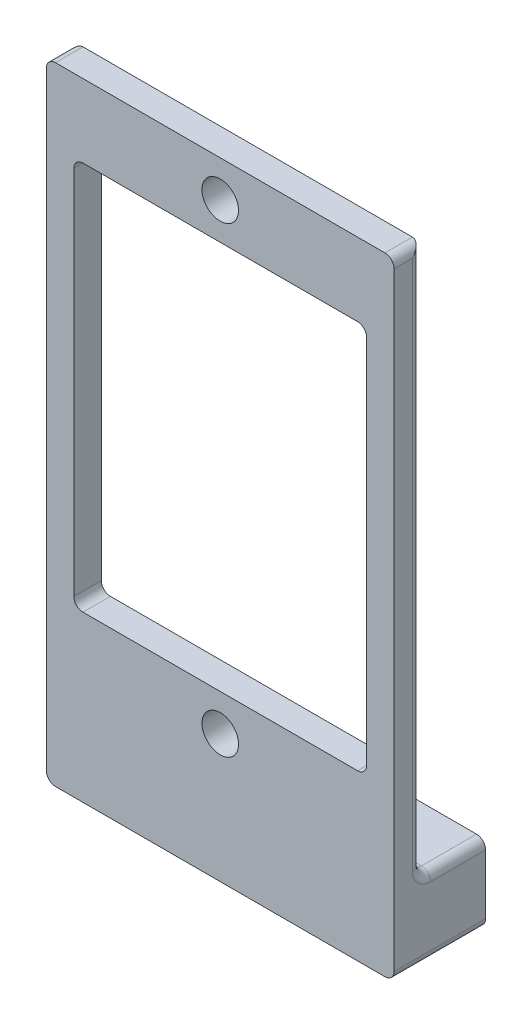
ISO-10303-21;
HEADER;
FILE_DESCRIPTION(('STEP AP214'),'2;1');
FILE_NAME('part.step','',(''),(''),'','','');
FILE_SCHEMA(('AUTOMOTIVE_DESIGN { 1 0 10303 214 1 1 1 1 }'));
ENDSEC;
DATA;
#1=APPLICATION_CONTEXT('core data for automotive mechanical design processes');
#2=APPLICATION_PROTOCOL_DEFINITION('international standard','automotive_design',2000,#1);
#3=PRODUCT_CONTEXT('',#1,'mechanical');
#4=PRODUCT('Part','Part','',(#3));
#5=PRODUCT_RELATED_PRODUCT_CATEGORY('part','',(#4));
#6=PRODUCT_DEFINITION_FORMATION('','',#4);
#7=PRODUCT_DEFINITION_CONTEXT('part definition',#1,'design');
#8=PRODUCT_DEFINITION('design','',#6,#7);
#9=PRODUCT_DEFINITION_SHAPE('','',#8);
#10=(LENGTH_UNIT() NAMED_UNIT(*) SI_UNIT(.MILLI.,.METRE.));
#11=(NAMED_UNIT(*) PLANE_ANGLE_UNIT() SI_UNIT($,.RADIAN.));
#12=(NAMED_UNIT(*) SI_UNIT($,.STERADIAN.) SOLID_ANGLE_UNIT());
#13=UNCERTAINTY_MEASURE_WITH_UNIT(LENGTH_MEASURE(1.E-05),#10,'distance_accuracy_value','');
#14=(GEOMETRIC_REPRESENTATION_CONTEXT(3) GLOBAL_UNCERTAINTY_ASSIGNED_CONTEXT((#13)) GLOBAL_UNIT_ASSIGNED_CONTEXT((#10,
#11,#12)) REPRESENTATION_CONTEXT('',''));
#15=CARTESIAN_POINT('',(0.,0.,0.));
#16=DIRECTION('',(0.,0.,1.));
#17=DIRECTION('',(1.,0.,0.));
#18=AXIS2_PLACEMENT_3D('',#15,#16,#17);
#19=CARTESIAN_POINT('',(0.,0.,3.));
#20=DIRECTION('',(0.,0.,-1.));
#21=DIRECTION('',(-1.,0.,0.));
#22=AXIS2_PLACEMENT_3D('',#19,#20,#21);
#23=PLANE('',#22);
#24=DIRECTION('',(0.,-1.,0.));
#25=VECTOR('',#24,1.);
#26=CARTESIAN_POINT('',(-15.,29.25,3.));
#27=LINE('',#26,#25);
#28=CARTESIAN_POINT('',(-15.,28.25,3.));
#29=VERTEX_POINT('',#28);
#30=CARTESIAN_POINT('',(-15.,-38.25,3.));
#31=VERTEX_POINT('',#30);
#32=EDGE_CURVE('E379',#29,#31,#27,.T.);
#33=ORIENTED_EDGE('',*,*,#32,.T.);
#34=CARTESIAN_POINT('',(-14.,-38.25,3.));
#35=DIRECTION('',(0.,0.,-1.));
#36=DIRECTION('',(-1.,0.,0.));
#37=AXIS2_PLACEMENT_3D('',#34,#35,#36);
#38=CIRCLE('',#37,1.);
#39=CARTESIAN_POINT('',(-14.,-39.25,3.));
#40=VERTEX_POINT('',#39);
#41=EDGE_CURVE('E285',#31,#40,#38,.F.);
#42=ORIENTED_EDGE('',*,*,#41,.T.);
#43=DIRECTION('',(1.,0.,0.));
#44=VECTOR('',#43,1.);
#45=CARTESIAN_POINT('',(-15.,-39.25,3.));
#46=LINE('',#45,#44);
#47=CARTESIAN_POINT('',(22.,-39.25,3.));
#48=VERTEX_POINT('',#47);
#49=EDGE_CURVE('E372',#40,#48,#46,.T.);
#50=ORIENTED_EDGE('',*,*,#49,.T.);
#51=CARTESIAN_POINT('',(22.,-38.25,3.));
#52=DIRECTION('',(0.,0.,-1.));
#53=DIRECTION('',(-1.,0.,0.));
#54=AXIS2_PLACEMENT_3D('',#51,#52,#53);
#55=CIRCLE('',#54,1.);
#56=CARTESIAN_POINT('',(23.,-38.25,3.));
#57=VERTEX_POINT('',#56);
#58=EDGE_CURVE('E283',#48,#57,#55,.F.);
#59=ORIENTED_EDGE('',*,*,#58,.T.);
#60=DIRECTION('',(0.,1.,0.));
#61=VECTOR('',#60,1.);
#62=CARTESIAN_POINT('',(23.,29.25,3.));
#63=LINE('',#62,#61);
#64=CARTESIAN_POINT('',(23.,28.25,3.));
#65=VERTEX_POINT('',#64);
#66=EDGE_CURVE('E375',#57,#65,#63,.T.);
#67=ORIENTED_EDGE('',*,*,#66,.T.);
#68=CARTESIAN_POINT('',(22.,28.25,3.));
#69=DIRECTION('',(0.,0.,-1.));
#70=DIRECTION('',(-1.,0.,0.));
#71=AXIS2_PLACEMENT_3D('',#68,#69,#70);
#72=CIRCLE('',#71,1.);
#73=CARTESIAN_POINT('',(22.,29.25,3.));
#74=VERTEX_POINT('',#73);
#75=EDGE_CURVE('E63',#65,#74,#72,.F.);
#76=ORIENTED_EDGE('',*,*,#75,.T.);
#77=DIRECTION('',(-1.,0.,0.));
#78=VECTOR('',#77,1.);
#79=CARTESIAN_POINT('',(0.,29.25,3.));
#80=LINE('',#79,#78);
#81=CARTESIAN_POINT('',(-14.,29.25,3.));
#82=VERTEX_POINT('',#81);
#83=EDGE_CURVE('E377',#74,#82,#80,.T.);
#84=ORIENTED_EDGE('',*,*,#83,.T.);
#85=CARTESIAN_POINT('',(-14.,28.25,3.));
#86=DIRECTION('',(0.,0.,-1.));
#87=DIRECTION('',(-1.,0.,0.));
#88=AXIS2_PLACEMENT_3D('',#85,#86,#87);
#89=CIRCLE('',#88,1.);
#90=EDGE_CURVE('E280',#82,#29,#89,.F.);
#91=ORIENTED_EDGE('',*,*,#90,.T.);
#92=EDGE_LOOP('',(#33,#42,#50,#59,#67,#76,#84,#91));
#93=FACE_BOUND('',#92,.T.);
#94=DIRECTION('',(1.,0.,0.));
#95=VECTOR('',#94,1.);
#96=CARTESIAN_POINT('',(-12.,-21.25,3.));
#97=LINE('',#96,#95);
#98=CARTESIAN_POINT('',(-11.,-21.25,3.));
#99=VERTEX_POINT('',#98);
#100=CARTESIAN_POINT('',(19.,-21.25,3.));
#101=VERTEX_POINT('',#100);
#102=EDGE_CURVE('E348',#99,#101,#97,.T.);
#103=ORIENTED_EDGE('',*,*,#102,.F.);
#104=CARTESIAN_POINT('',(-11.,-20.25,3.));
#105=DIRECTION('',(0.,0.,-1.));
#106=DIRECTION('',(-1.,0.,0.));
#107=AXIS2_PLACEMENT_3D('',#104,#105,#106);
#108=CIRCLE('',#107,1.);
#109=CARTESIAN_POINT('',(-12.,-20.25,3.));
#110=VERTEX_POINT('',#109);
#111=EDGE_CURVE('E11',#99,#110,#108,.T.);
#112=ORIENTED_EDGE('',*,*,#111,.T.);
#113=DIRECTION('',(0.,-1.,0.));
#114=VECTOR('',#113,1.);
#115=CARTESIAN_POINT('',(-12.,-21.25,3.));
#116=LINE('',#115,#114);
#117=CARTESIAN_POINT('',(-12.,20.25,3.));
#118=VERTEX_POINT('',#117);
#119=EDGE_CURVE('E358',#118,#110,#116,.T.);
#120=ORIENTED_EDGE('',*,*,#119,.F.);
#121=CARTESIAN_POINT('',(-11.,20.25,3.));
#122=DIRECTION('',(0.,0.,-1.));
#123=DIRECTION('',(-1.,0.,0.));
#124=AXIS2_PLACEMENT_3D('',#121,#122,#123);
#125=CIRCLE('',#124,1.);
#126=CARTESIAN_POINT('',(-11.,21.25,3.));
#127=VERTEX_POINT('',#126);
#128=EDGE_CURVE('E300',#118,#127,#125,.T.);
#129=ORIENTED_EDGE('',*,*,#128,.T.);
#130=DIRECTION('',(-1.,0.,0.));
#131=VECTOR('',#130,1.);
#132=CARTESIAN_POINT('',(-12.,21.25,3.));
#133=LINE('',#132,#131);
#134=CARTESIAN_POINT('',(19.,21.25,3.));
#135=VERTEX_POINT('',#134);
#136=EDGE_CURVE('E355',#135,#127,#133,.T.);
#137=ORIENTED_EDGE('',*,*,#136,.F.);
#138=CARTESIAN_POINT('',(19.,20.25,3.));
#139=DIRECTION('',(0.,0.,-1.));
#140=DIRECTION('',(-1.,0.,0.));
#141=AXIS2_PLACEMENT_3D('',#138,#139,#140);
#142=CIRCLE('',#141,1.);
#143=CARTESIAN_POINT('',(20.,20.25,3.));
#144=VERTEX_POINT('',#143);
#145=EDGE_CURVE('E296',#135,#144,#142,.T.);
#146=ORIENTED_EDGE('',*,*,#145,.T.);
#147=DIRECTION('',(0.,1.,0.));
#148=VECTOR('',#147,1.);
#149=CARTESIAN_POINT('',(20.,21.25,3.));
#150=LINE('',#149,#148);
#151=CARTESIAN_POINT('',(20.,-20.25,3.));
#152=VERTEX_POINT('',#151);
#153=EDGE_CURVE('E351',#152,#144,#150,.T.);
#154=ORIENTED_EDGE('',*,*,#153,.F.);
#155=CARTESIAN_POINT('',(19.,-20.25,3.));
#156=DIRECTION('',(0.,0.,-1.));
#157=DIRECTION('',(-1.,0.,0.));
#158=AXIS2_PLACEMENT_3D('',#155,#156,#157);
#159=CIRCLE('',#158,1.);
#160=EDGE_CURVE('E292',#152,#101,#159,.T.);
#161=ORIENTED_EDGE('',*,*,#160,.T.);
#162=EDGE_LOOP('',(#103,#112,#120,#129,#137,#146,#154,#161));
#163=FACE_BOUND('',#162,.T.);
#164=CARTESIAN_POINT('',(4.,25.25,3.));
#165=DIRECTION('',(0.,0.,1.));
#166=DIRECTION('',(1.,0.,0.));
#167=AXIS2_PLACEMENT_3D('',#164,#165,#166);
#168=CIRCLE('',#167,2.);
#169=CARTESIAN_POINT('',(6.,25.25,3.));
#170=VERTEX_POINT('',#169);
#171=EDGE_CURVE('E342',#170,#170,#168,.T.);
#172=ORIENTED_EDGE('',*,*,#171,.F.);
#173=EDGE_LOOP('',(#172));
#174=FACE_BOUND('',#173,.T.);
#175=CARTESIAN_POINT('',(4.,-25.25,3.));
#176=DIRECTION('',(0.,0.,1.));
#177=DIRECTION('',(1.,0.,0.));
#178=AXIS2_PLACEMENT_3D('',#175,#176,#177);
#179=CIRCLE('',#178,2.);
#180=CARTESIAN_POINT('',(6.,-25.25,3.));
#181=VERTEX_POINT('',#180);
#182=EDGE_CURVE('E336',#181,#181,#179,.T.);
#183=ORIENTED_EDGE('',*,*,#182,.F.);
#184=EDGE_LOOP('',(#183));
#185=FACE_BOUND('',#184,.T.);
#186=ADVANCED_FACE('F39',(#93,#163,#174,#185),#23,.F.);
#187=CARTESIAN_POINT('',(0.,0.,0.));
#188=DIRECTION('',(0.,0.,-1.));
#189=DIRECTION('',(-1.,0.,0.));
#190=AXIS2_PLACEMENT_3D('',#187,#188,#189);
#191=PLANE('',#190);
#192=DIRECTION('',(1.,0.,0.));
#193=VECTOR('',#192,1.);
#194=CARTESIAN_POINT('',(0.,-29.75,0.));
#195=LINE('',#194,#193);
#196=CARTESIAN_POINT('',(22.,-29.75,0.));
#197=VERTEX_POINT('',#196);
#198=CARTESIAN_POINT('',(-14.,-29.75,0.));
#199=VERTEX_POINT('',#198);
#200=EDGE_CURVE('E239',#197,#199,#195,.F.);
#201=ORIENTED_EDGE('',*,*,#200,.T.);
#202=DIRECTION('',(0.,-1.,0.));
#203=VECTOR('',#202,1.);
#204=CARTESIAN_POINT('',(-14.,29.25,0.));
#205=LINE('',#204,#203);
#206=CARTESIAN_POINT('',(-14.,29.25,0.));
#207=VERTEX_POINT('',#206);
#208=EDGE_CURVE('E241',#199,#207,#205,.F.);
#209=ORIENTED_EDGE('',*,*,#208,.T.);
#210=DIRECTION('',(-1.,0.,0.));
#211=VECTOR('',#210,1.);
#212=CARTESIAN_POINT('',(0.,29.25,0.));
#213=LINE('',#212,#211);
#214=CARTESIAN_POINT('',(22.,29.25,0.));
#215=VERTEX_POINT('',#214);
#216=EDGE_CURVE('E361',#215,#207,#213,.T.);
#217=ORIENTED_EDGE('',*,*,#216,.F.);
#218=DIRECTION('',(0.,1.,0.));
#219=VECTOR('',#218,1.);
#220=CARTESIAN_POINT('',(22.,-30.75,0.));
#221=LINE('',#220,#219);
#222=EDGE_CURVE('E202',#215,#197,#221,.F.);
#223=ORIENTED_EDGE('',*,*,#222,.T.);
#224=EDGE_LOOP('',(#201,#209,#217,#223));
#225=FACE_BOUND('',#224,.T.);
#226=CARTESIAN_POINT('',(4.,25.25,0.));
#227=DIRECTION('',(0.,0.,1.));
#228=DIRECTION('',(1.,0.,0.));
#229=AXIS2_PLACEMENT_3D('',#226,#227,#228);
#230=CIRCLE('',#229,2.);
#231=CARTESIAN_POINT('',(6.,25.25,0.));
#232=VERTEX_POINT('',#231);
#233=EDGE_CURVE('E339',#232,#232,#230,.T.);
#234=ORIENTED_EDGE('',*,*,#233,.T.);
#235=EDGE_LOOP('',(#234));
#236=FACE_BOUND('',#235,.T.);
#237=DIRECTION('',(-1.,0.,0.));
#238=VECTOR('',#237,1.);
#239=CARTESIAN_POINT('',(-12.,21.25,0.));
#240=LINE('',#239,#238);
#241=CARTESIAN_POINT('',(19.,21.25,0.));
#242=VERTEX_POINT('',#241);
#243=CARTESIAN_POINT('',(-11.,21.25,0.));
#244=VERTEX_POINT('',#243);
#245=EDGE_CURVE('E367',#242,#244,#240,.T.);
#246=ORIENTED_EDGE('',*,*,#245,.T.);
#247=CARTESIAN_POINT('',(-11.,20.25,0.));
#248=DIRECTION('',(0.,0.,-1.));
#249=DIRECTION('',(-1.,0.,0.));
#250=AXIS2_PLACEMENT_3D('',#247,#248,#249);
#251=CIRCLE('',#250,1.);
#252=CARTESIAN_POINT('',(-12.,20.25,0.));
#253=VERTEX_POINT('',#252);
#254=EDGE_CURVE('E298',#244,#253,#251,.F.);
#255=ORIENTED_EDGE('',*,*,#254,.T.);
#256=DIRECTION('',(0.,-1.,0.));
#257=VECTOR('',#256,1.);
#258=CARTESIAN_POINT('',(-12.,-21.25,0.));
#259=LINE('',#258,#257);
#260=CARTESIAN_POINT('',(-12.,-20.25,0.));
#261=VERTEX_POINT('',#260);
#262=EDGE_CURVE('E352',#253,#261,#259,.T.);
#263=ORIENTED_EDGE('',*,*,#262,.T.);
#264=CARTESIAN_POINT('',(-11.,-20.25,0.));
#265=DIRECTION('',(0.,0.,-1.));
#266=DIRECTION('',(-1.,0.,0.));
#267=AXIS2_PLACEMENT_3D('',#264,#265,#266);
#268=CIRCLE('',#267,1.);
#269=CARTESIAN_POINT('',(-11.,-21.25,0.));
#270=VERTEX_POINT('',#269);
#271=EDGE_CURVE('E48',#261,#270,#268,.F.);
#272=ORIENTED_EDGE('',*,*,#271,.T.);
#273=DIRECTION('',(1.,0.,0.));
#274=VECTOR('',#273,1.);
#275=CARTESIAN_POINT('',(-12.,-21.25,0.));
#276=LINE('',#275,#274);
#277=CARTESIAN_POINT('',(19.,-21.25,0.));
#278=VERTEX_POINT('',#277);
#279=EDGE_CURVE('E345',#270,#278,#276,.T.);
#280=ORIENTED_EDGE('',*,*,#279,.T.);
#281=CARTESIAN_POINT('',(19.,-20.25,0.));
#282=DIRECTION('',(0.,0.,-1.));
#283=DIRECTION('',(-1.,0.,0.));
#284=AXIS2_PLACEMENT_3D('',#281,#282,#283);
#285=CIRCLE('',#284,1.);
#286=CARTESIAN_POINT('',(20.,-20.25,0.));
#287=VERTEX_POINT('',#286);
#288=EDGE_CURVE('E290',#278,#287,#285,.F.);
#289=ORIENTED_EDGE('',*,*,#288,.T.);
#290=DIRECTION('',(0.,1.,0.));
#291=VECTOR('',#290,1.);
#292=CARTESIAN_POINT('',(20.,21.25,0.));
#293=LINE('',#292,#291);
#294=CARTESIAN_POINT('',(20.,20.25,0.));
#295=VERTEX_POINT('',#294);
#296=EDGE_CURVE('E364',#287,#295,#293,.T.);
#297=ORIENTED_EDGE('',*,*,#296,.T.);
#298=CARTESIAN_POINT('',(19.,20.25,0.));
#299=DIRECTION('',(0.,0.,-1.));
#300=DIRECTION('',(-1.,0.,0.));
#301=AXIS2_PLACEMENT_3D('',#298,#299,#300);
#302=CIRCLE('',#301,1.);
#303=EDGE_CURVE('E294',#295,#242,#302,.F.);
#304=ORIENTED_EDGE('',*,*,#303,.T.);
#305=EDGE_LOOP('',(#246,#255,#263,#272,#280,#289,#297,#304));
#306=FACE_BOUND('',#305,.T.);
#307=CARTESIAN_POINT('',(4.,-25.25,0.));
#308=DIRECTION('',(0.,0.,1.));
#309=DIRECTION('',(1.,0.,0.));
#310=AXIS2_PLACEMENT_3D('',#307,#308,#309);
#311=CIRCLE('',#310,2.);
#312=CARTESIAN_POINT('',(6.,-25.25,0.));
#313=VERTEX_POINT('',#312);
#314=EDGE_CURVE('E211',#313,#313,#311,.T.);
#315=ORIENTED_EDGE('',*,*,#314,.T.);
#316=EDGE_LOOP('',(#315));
#317=FACE_BOUND('',#316,.T.);
#318=ADVANCED_FACE('F423',(#225,#236,#306,#317),#191,.T.);
#319=CARTESIAN_POINT('',(-15.,-39.25,3.));
#320=DIRECTION('',(0.,1.,0.));
#321=DIRECTION('',(0.,0.,1.));
#322=AXIS2_PLACEMENT_3D('',#319,#320,#321);
#323=PLANE('',#322);
#324=ORIENTED_EDGE('',*,*,#49,.F.);
#325=DIRECTION('',(0.,0.,-1.));
#326=VECTOR('',#325,1.);
#327=CARTESIAN_POINT('',(-14.,-39.25,3.));
#328=LINE('',#327,#326);
#329=CARTESIAN_POINT('',(-14.,-39.25,-7.));
#330=VERTEX_POINT('',#329);
#331=EDGE_CURVE('E277',#40,#330,#328,.T.);
#332=ORIENTED_EDGE('',*,*,#331,.T.);
#333=DIRECTION('',(-1.,0.,0.));
#334=VECTOR('',#333,1.);
#335=CARTESIAN_POINT('',(23.,-39.25,-7.));
#336=LINE('',#335,#334);
#337=CARTESIAN_POINT('',(22.,-39.25,-7.));
#338=VERTEX_POINT('',#337);
#339=EDGE_CURVE('E329',#338,#330,#336,.T.);
#340=ORIENTED_EDGE('',*,*,#339,.F.);
#341=DIRECTION('',(0.,0.,-1.));
#342=VECTOR('',#341,1.);
#343=CARTESIAN_POINT('',(22.,-39.25,3.));
#344=LINE('',#343,#342);
#345=EDGE_CURVE('E275',#338,#48,#344,.F.);
#346=ORIENTED_EDGE('',*,*,#345,.T.);
#347=EDGE_LOOP('',(#324,#332,#340,#346));
#348=FACE_BOUND('',#347,.T.);
#349=ADVANCED_FACE('F409',(#348),#323,.F.);
#350=CARTESIAN_POINT('',(23.,29.25,3.));
#351=DIRECTION('',(-1.,0.,0.));
#352=DIRECTION('',(0.,0.,1.));
#353=AXIS2_PLACEMENT_3D('',#350,#351,#352);
#354=PLANE('',#353);
#355=ORIENTED_EDGE('',*,*,#66,.F.);
#356=DIRECTION('',(0.,0.,-1.));
#357=VECTOR('',#356,1.);
#358=CARTESIAN_POINT('',(23.,-38.25,3.));
#359=LINE('',#358,#357);
#360=CARTESIAN_POINT('',(23.,-38.25,-7.));
#361=VERTEX_POINT('',#360);
#362=EDGE_CURVE('E252',#57,#361,#359,.T.);
#363=ORIENTED_EDGE('',*,*,#362,.T.);
#364=DIRECTION('',(0.,-1.,0.));
#365=VECTOR('',#364,1.);
#366=CARTESIAN_POINT('',(23.,-39.25,-7.));
#367=LINE('',#366,#365);
#368=CARTESIAN_POINT('',(23.,-31.75,-7.));
#369=VERTEX_POINT('',#368);
#370=EDGE_CURVE('E323',#369,#361,#367,.T.);
#371=ORIENTED_EDGE('',*,*,#370,.F.);
#372=DIRECTION('',(0.,0.,1.));
#373=VECTOR('',#372,1.);
#374=CARTESIAN_POINT('',(23.,-31.75,3.));
#375=LINE('',#374,#373);
#376=CARTESIAN_POINT('',(23.,-31.75,-1.));
#377=VERTEX_POINT('',#376);
#378=EDGE_CURVE('E250',#369,#377,#375,.T.);
#379=ORIENTED_EDGE('',*,*,#378,.T.);
#380=CARTESIAN_POINT('',(23.,-29.75,-1.));
#381=DIRECTION('',(-1.,0.,0.));
#382=DIRECTION('',(0.,0.,1.));
#383=AXIS2_PLACEMENT_3D('',#380,#381,#382);
#384=CIRCLE('',#383,2.);
#385=CARTESIAN_POINT('',(23.,-29.75,1.));
#386=VERTEX_POINT('',#385);
#387=EDGE_CURVE('E247',#386,#377,#384,.F.);
#388=ORIENTED_EDGE('',*,*,#387,.F.);
#389=DIRECTION('',(0.,1.,0.));
#390=VECTOR('',#389,1.);
#391=CARTESIAN_POINT('',(23.,29.25,1.));
#392=LINE('',#391,#390);
#393=CARTESIAN_POINT('',(23.,28.25,1.));
#394=VERTEX_POINT('',#393);
#395=EDGE_CURVE('E245',#386,#394,#392,.T.);
#396=ORIENTED_EDGE('',*,*,#395,.T.);
#397=DIRECTION('',(0.,0.,-1.));
#398=VECTOR('',#397,1.);
#399=CARTESIAN_POINT('',(23.,28.25,3.));
#400=LINE('',#399,#398);
#401=EDGE_CURVE('E243',#394,#65,#400,.F.);
#402=ORIENTED_EDGE('',*,*,#401,.T.);
#403=EDGE_LOOP('',(#355,#363,#371,#379,#388,#396,#402));
#404=FACE_BOUND('',#403,.T.);
#405=ADVANCED_FACE('F416',(#404),#354,.F.);
#406=CARTESIAN_POINT('',(0.,29.25,3.));
#407=DIRECTION('',(0.,-1.,0.));
#408=DIRECTION('',(1.,0.,0.));
#409=AXIS2_PLACEMENT_3D('',#406,#407,#408);
#410=PLANE('',#409);
#411=ORIENTED_EDGE('',*,*,#83,.F.);
#412=DIRECTION('',(0.,0.,-1.));
#413=VECTOR('',#412,1.);
#414=CARTESIAN_POINT('',(22.,29.25,3.));
#415=LINE('',#414,#413);
#416=EDGE_CURVE('E288',#74,#215,#415,.T.);
#417=ORIENTED_EDGE('',*,*,#416,.T.);
#418=ORIENTED_EDGE('',*,*,#216,.T.);
#419=DIRECTION('',(0.,0.,-1.));
#420=VECTOR('',#419,1.);
#421=CARTESIAN_POINT('',(-14.,29.25,3.));
#422=LINE('',#421,#420);
#423=EDGE_CURVE('E56',#207,#82,#422,.F.);
#424=ORIENTED_EDGE('',*,*,#423,.T.);
#425=EDGE_LOOP('',(#411,#417,#418,#424));
#426=FACE_BOUND('',#425,.T.);
#427=ADVANCED_FACE('F383',(#426),#410,.F.);
#428=CARTESIAN_POINT('',(-15.,29.25,3.));
#429=DIRECTION('',(1.,0.,0.));
#430=DIRECTION('',(0.,0.,-1.));
#431=AXIS2_PLACEMENT_3D('',#428,#429,#430);
#432=PLANE('',#431);
#433=DIRECTION('',(0.,1.,0.));
#434=VECTOR('',#433,1.);
#435=CARTESIAN_POINT('',(-15.,-39.25,-7.));
#436=LINE('',#435,#434);
#437=CARTESIAN_POINT('',(-15.,-38.25,-7.));
#438=VERTEX_POINT('',#437);
#439=CARTESIAN_POINT('',(-15.,-31.75,-7.));
#440=VERTEX_POINT('',#439);
#441=EDGE_CURVE('E198',#438,#440,#436,.T.);
#442=ORIENTED_EDGE('',*,*,#441,.F.);
#443=DIRECTION('',(0.,0.,-1.));
#444=VECTOR('',#443,1.);
#445=CARTESIAN_POINT('',(-15.,-38.25,3.));
#446=LINE('',#445,#444);
#447=EDGE_CURVE('E231',#438,#31,#446,.F.);
#448=ORIENTED_EDGE('',*,*,#447,.T.);
#449=ORIENTED_EDGE('',*,*,#32,.F.);
#450=DIRECTION('',(0.,0.,-1.));
#451=VECTOR('',#450,1.);
#452=CARTESIAN_POINT('',(-15.,28.25,3.));
#453=LINE('',#452,#451);
#454=CARTESIAN_POINT('',(-15.,28.25,1.));
#455=VERTEX_POINT('',#454);
#456=EDGE_CURVE('E217',#29,#455,#453,.T.);
#457=ORIENTED_EDGE('',*,*,#456,.T.);
#458=DIRECTION('',(0.,-1.,0.));
#459=VECTOR('',#458,1.);
#460=CARTESIAN_POINT('',(-15.,-30.75,1.));
#461=LINE('',#460,#459);
#462=CARTESIAN_POINT('',(-15.,-29.75,1.));
#463=VERTEX_POINT('',#462);
#464=EDGE_CURVE('E220',#455,#463,#461,.T.);
#465=ORIENTED_EDGE('',*,*,#464,.T.);
#466=CARTESIAN_POINT('',(-15.,-29.75,-1.));
#467=DIRECTION('',(1.,0.,0.));
#468=DIRECTION('',(0.,0.,-1.));
#469=AXIS2_PLACEMENT_3D('',#466,#467,#468);
#470=CIRCLE('',#469,2.);
#471=CARTESIAN_POINT('',(-15.,-31.75,-1.));
#472=VERTEX_POINT('',#471);
#473=EDGE_CURVE('E226',#472,#463,#470,.F.);
#474=ORIENTED_EDGE('',*,*,#473,.F.);
#475=DIRECTION('',(0.,0.,1.));
#476=VECTOR('',#475,1.);
#477=CARTESIAN_POINT('',(-15.,-31.75,3.));
#478=LINE('',#477,#476);
#479=EDGE_CURVE('E229',#472,#440,#478,.F.);
#480=ORIENTED_EDGE('',*,*,#479,.T.);
#481=EDGE_LOOP('',(#442,#448,#449,#457,#465,#474,#480));
#482=FACE_BOUND('',#481,.T.);
#483=ADVANCED_FACE('F398',(#482),#432,.F.);
#484=CARTESIAN_POINT('',(-12.,-21.25,3.));
#485=DIRECTION('',(0.,1.,0.));
#486=DIRECTION('',(0.,0.,1.));
#487=AXIS2_PLACEMENT_3D('',#484,#485,#486);
#488=PLANE('',#487);
#489=ORIENTED_EDGE('',*,*,#102,.T.);
#490=DIRECTION('',(0.,0.,-1.));
#491=VECTOR('',#490,1.);
#492=CARTESIAN_POINT('',(19.,-21.25,0.));
#493=LINE('',#492,#491);
#494=EDGE_CURVE('E257',#101,#278,#493,.T.);
#495=ORIENTED_EDGE('',*,*,#494,.T.);
#496=ORIENTED_EDGE('',*,*,#279,.F.);
#497=DIRECTION('',(0.,0.,-1.));
#498=VECTOR('',#497,1.);
#499=CARTESIAN_POINT('',(-11.,-21.25,3.));
#500=LINE('',#499,#498);
#501=EDGE_CURVE('E255',#270,#99,#500,.F.);
#502=ORIENTED_EDGE('',*,*,#501,.T.);
#503=EDGE_LOOP('',(#489,#495,#496,#502));
#504=FACE_BOUND('',#503,.T.);
#505=ADVANCED_FACE('F447',(#504),#488,.T.);
#506=CARTESIAN_POINT('',(20.,21.25,3.));
#507=DIRECTION('',(-1.,0.,0.));
#508=DIRECTION('',(0.,0.,1.));
#509=AXIS2_PLACEMENT_3D('',#506,#507,#508);
#510=PLANE('',#509);
#511=ORIENTED_EDGE('',*,*,#296,.F.);
#512=DIRECTION('',(0.,0.,-1.));
#513=VECTOR('',#512,1.);
#514=CARTESIAN_POINT('',(20.,-20.25,3.));
#515=LINE('',#514,#513);
#516=EDGE_CURVE('E263',#287,#152,#515,.F.);
#517=ORIENTED_EDGE('',*,*,#516,.T.);
#518=ORIENTED_EDGE('',*,*,#153,.T.);
#519=DIRECTION('',(0.,0.,-1.));
#520=VECTOR('',#519,1.);
#521=CARTESIAN_POINT('',(20.,20.25,0.));
#522=LINE('',#521,#520);
#523=EDGE_CURVE('E260',#144,#295,#522,.T.);
#524=ORIENTED_EDGE('',*,*,#523,.T.);
#525=EDGE_LOOP('',(#511,#517,#518,#524));
#526=FACE_BOUND('',#525,.T.);
#527=ADVANCED_FACE('F479',(#526),#510,.T.);
#528=CARTESIAN_POINT('',(-12.,21.25,3.));
#529=DIRECTION('',(0.,-1.,0.));
#530=DIRECTION('',(1.,0.,0.));
#531=AXIS2_PLACEMENT_3D('',#528,#529,#530);
#532=PLANE('',#531);
#533=ORIENTED_EDGE('',*,*,#245,.F.);
#534=DIRECTION('',(0.,0.,-1.));
#535=VECTOR('',#534,1.);
#536=CARTESIAN_POINT('',(19.,21.25,3.));
#537=LINE('',#536,#535);
#538=EDGE_CURVE('E268',#242,#135,#537,.F.);
#539=ORIENTED_EDGE('',*,*,#538,.T.);
#540=ORIENTED_EDGE('',*,*,#136,.T.);
#541=DIRECTION('',(0.,0.,-1.));
#542=VECTOR('',#541,1.);
#543=CARTESIAN_POINT('',(-11.,21.25,0.));
#544=LINE('',#543,#542);
#545=EDGE_CURVE('E265',#127,#244,#544,.T.);
#546=ORIENTED_EDGE('',*,*,#545,.T.);
#547=EDGE_LOOP('',(#533,#539,#540,#546));
#548=FACE_BOUND('',#547,.T.);
#549=ADVANCED_FACE('F486',(#548),#532,.T.);
#550=CARTESIAN_POINT('',(-12.,-21.25,3.));
#551=DIRECTION('',(1.,0.,0.));
#552=DIRECTION('',(0.,0.,-1.));
#553=AXIS2_PLACEMENT_3D('',#550,#551,#552);
#554=PLANE('',#553);
#555=ORIENTED_EDGE('',*,*,#262,.F.);
#556=DIRECTION('',(0.,0.,-1.));
#557=VECTOR('',#556,1.);
#558=CARTESIAN_POINT('',(-12.,20.25,3.));
#559=LINE('',#558,#557);
#560=EDGE_CURVE('E273',#253,#118,#559,.F.);
#561=ORIENTED_EDGE('',*,*,#560,.T.);
#562=ORIENTED_EDGE('',*,*,#119,.T.);
#563=DIRECTION('',(0.,0.,-1.));
#564=VECTOR('',#563,1.);
#565=CARTESIAN_POINT('',(-12.,-20.25,0.));
#566=LINE('',#565,#564);
#567=EDGE_CURVE('E270',#110,#261,#566,.T.);
#568=ORIENTED_EDGE('',*,*,#567,.T.);
#569=EDGE_LOOP('',(#555,#561,#562,#568));
#570=FACE_BOUND('',#569,.T.);
#571=ADVANCED_FACE('F493',(#570),#554,.T.);
#572=CARTESIAN_POINT('',(4.,25.25,3.));
#573=DIRECTION('',(0.,0.,-1.));
#574=DIRECTION('',(-1.,0.,0.));
#575=AXIS2_PLACEMENT_3D('',#572,#573,#574);
#576=CYLINDRICAL_SURFACE('',#575,2.);
#577=ORIENTED_EDGE('',*,*,#171,.T.);
#578=EDGE_LOOP('',(#577));
#579=FACE_BOUND('',#578,.T.);
#580=ORIENTED_EDGE('',*,*,#233,.F.);
#581=EDGE_LOOP('',(#580));
#582=FACE_BOUND('',#581,.T.);
#583=ADVANCED_FACE('F501',(#579,#582),#576,.F.);
#584=CARTESIAN_POINT('',(4.,-25.25,3.));
#585=DIRECTION('',(0.,0.,-1.));
#586=DIRECTION('',(-1.,0.,0.));
#587=AXIS2_PLACEMENT_3D('',#584,#585,#586);
#588=CYLINDRICAL_SURFACE('',#587,2.);
#589=ORIENTED_EDGE('',*,*,#182,.T.);
#590=EDGE_LOOP('',(#589));
#591=FACE_BOUND('',#590,.T.);
#592=ORIENTED_EDGE('',*,*,#314,.F.);
#593=EDGE_LOOP('',(#592));
#594=FACE_BOUND('',#593,.T.);
#595=ADVANCED_FACE('F510',(#591,#594),#588,.F.);
#596=CARTESIAN_POINT('',(23.,-30.75,-7.));
#597=DIRECTION('',(0.,-1.,0.));
#598=DIRECTION('',(0.,0.,-1.));
#599=AXIS2_PLACEMENT_3D('',#596,#597,#598);
#600=PLANE('',#599);
#601=DIRECTION('',(1.,0.,0.));
#602=VECTOR('',#601,1.);
#603=CARTESIAN_POINT('',(23.,-30.75,-7.));
#604=LINE('',#603,#602);
#605=CARTESIAN_POINT('',(-14.,-30.75,-7.));
#606=VERTEX_POINT('',#605);
#607=CARTESIAN_POINT('',(22.,-30.75,-7.));
#608=VERTEX_POINT('',#607);
#609=EDGE_CURVE('E195',#606,#608,#604,.T.);
#610=ORIENTED_EDGE('',*,*,#609,.F.);
#611=DIRECTION('',(0.,0.,1.));
#612=VECTOR('',#611,1.);
#613=CARTESIAN_POINT('',(-14.,-30.75,-7.));
#614=LINE('',#613,#612);
#615=CARTESIAN_POINT('',(-14.,-30.75,-1.));
#616=VERTEX_POINT('',#615);
#617=EDGE_CURVE('E208',#606,#616,#614,.T.);
#618=ORIENTED_EDGE('',*,*,#617,.T.);
#619=DIRECTION('',(1.,0.,0.));
#620=VECTOR('',#619,1.);
#621=CARTESIAN_POINT('',(23.,-30.75,-1.));
#622=LINE('',#621,#620);
#623=CARTESIAN_POINT('',(22.,-30.75,-1.));
#624=VERTEX_POINT('',#623);
#625=EDGE_CURVE('E218',#616,#624,#622,.T.);
#626=ORIENTED_EDGE('',*,*,#625,.T.);
#627=DIRECTION('',(0.,0.,1.));
#628=VECTOR('',#627,1.);
#629=CARTESIAN_POINT('',(22.,-30.75,-7.));
#630=LINE('',#629,#628);
#631=EDGE_CURVE('E210',#624,#608,#630,.F.);
#632=ORIENTED_EDGE('',*,*,#631,.T.);
#633=EDGE_LOOP('',(#610,#618,#626,#632));
#634=FACE_BOUND('',#633,.T.);
#635=ADVANCED_FACE('F207',(#634),#600,.F.);
#636=CARTESIAN_POINT('',(0.,0.,-7.));
#637=DIRECTION('',(0.,0.,1.));
#638=DIRECTION('',(1.,0.,0.));
#639=AXIS2_PLACEMENT_3D('',#636,#637,#638);
#640=PLANE('',#639);
#641=ORIENTED_EDGE('',*,*,#441,.T.);
#642=CARTESIAN_POINT('',(-14.,-31.75,-7.));
#643=DIRECTION('',(0.,0.,1.));
#644=DIRECTION('',(1.,0.,0.));
#645=AXIS2_PLACEMENT_3D('',#642,#643,#644);
#646=CIRCLE('',#645,1.);
#647=EDGE_CURVE('E192',#440,#606,#646,.F.);
#648=ORIENTED_EDGE('',*,*,#647,.T.);
#649=ORIENTED_EDGE('',*,*,#609,.T.);
#650=CARTESIAN_POINT('',(22.,-31.75,-7.));
#651=DIRECTION('',(0.,0.,1.));
#652=DIRECTION('',(1.,0.,0.));
#653=AXIS2_PLACEMENT_3D('',#650,#651,#652);
#654=CIRCLE('',#653,1.);
#655=EDGE_CURVE('E203',#608,#369,#654,.F.);
#656=ORIENTED_EDGE('',*,*,#655,.T.);
#657=ORIENTED_EDGE('',*,*,#370,.T.);
#658=CARTESIAN_POINT('',(22.,-38.25,-7.));
#659=DIRECTION('',(0.,0.,1.));
#660=DIRECTION('',(1.,0.,0.));
#661=AXIS2_PLACEMENT_3D('',#658,#659,#660);
#662=CIRCLE('',#661,1.);
#663=EDGE_CURVE('E233',#361,#338,#662,.F.);
#664=ORIENTED_EDGE('',*,*,#663,.T.);
#665=ORIENTED_EDGE('',*,*,#339,.T.);
#666=CARTESIAN_POINT('',(-14.,-38.25,-7.));
#667=DIRECTION('',(0.,0.,1.));
#668=DIRECTION('',(1.,0.,0.));
#669=AXIS2_PLACEMENT_3D('',#666,#667,#668);
#670=CIRCLE('',#669,1.);
#671=EDGE_CURVE('E235',#330,#438,#670,.F.);
#672=ORIENTED_EDGE('',*,*,#671,.T.);
#673=EDGE_LOOP('',(#641,#648,#649,#656,#657,#664,#665,#672));
#674=FACE_BOUND('',#673,.T.);
#675=ADVANCED_FACE('F194',(#674),#640,.F.);
#676=CARTESIAN_POINT('',(22.,28.25,3.));
#677=DIRECTION('',(0.,0.,-1.));
#678=DIRECTION('',(-1.,0.,0.));
#679=AXIS2_PLACEMENT_3D('',#676,#677,#678);
#680=CYLINDRICAL_SURFACE('',#679,1.);
#681=ORIENTED_EDGE('',*,*,#75,.F.);
#682=ORIENTED_EDGE('',*,*,#401,.F.);
#683=CARTESIAN_POINT('',(22.,28.25,1.));
#684=DIRECTION('',(0.,-0.707106781186547,-0.707106781186547));
#685=DIRECTION('',(0.,0.707106781186547,-0.707106781186547));
#686=AXIS2_PLACEMENT_3D('',#683,#684,#685);
#687=ELLIPSE('',#686,1.41421356237309,1.);
#688=EDGE_CURVE('E43',#215,#394,#687,.T.);
#689=ORIENTED_EDGE('',*,*,#688,.F.);
#690=ORIENTED_EDGE('',*,*,#416,.F.);
#691=EDGE_LOOP('',(#681,#682,#689,#690));
#692=FACE_BOUND('',#691,.T.);
#693=ADVANCED_FACE('F420',(#692),#680,.T.);
#694=CARTESIAN_POINT('',(22.,-31.75,3.));
#695=DIRECTION('',(0.,0.,1.));
#696=DIRECTION('',(1.,0.,0.));
#697=AXIS2_PLACEMENT_3D('',#694,#695,#696);
#698=CYLINDRICAL_SURFACE('',#697,1.);
#699=ORIENTED_EDGE('',*,*,#655,.F.);
#700=ORIENTED_EDGE('',*,*,#631,.F.);
#701=CARTESIAN_POINT('',(22.,-31.75,-1.));
#702=DIRECTION('',(0.,0.,1.));
#703=DIRECTION('',(1.,0.,0.));
#704=AXIS2_PLACEMENT_3D('',#701,#702,#703);
#705=CIRCLE('',#704,1.);
#706=EDGE_CURVE('E317',#377,#624,#705,.T.);
#707=ORIENTED_EDGE('',*,*,#706,.F.);
#708=ORIENTED_EDGE('',*,*,#378,.F.);
#709=EDGE_LOOP('',(#699,#700,#707,#708));
#710=FACE_BOUND('',#709,.T.);
#711=ADVANCED_FACE('F536',(#710),#698,.T.);
#712=CARTESIAN_POINT('',(22.,29.25,1.));
#713=DIRECTION('',(0.,-1.,0.));
#714=DIRECTION('',(0.,0.,-1.));
#715=AXIS2_PLACEMENT_3D('',#712,#713,#714);
#716=CYLINDRICAL_SURFACE('',#715,1.);
#717=ORIENTED_EDGE('',*,*,#688,.T.);
#718=ORIENTED_EDGE('',*,*,#395,.F.);
#719=CARTESIAN_POINT('',(22.,-29.75,1.));
#720=DIRECTION('',(0.,-1.,0.));
#721=DIRECTION('',(0.,0.,-1.));
#722=AXIS2_PLACEMENT_3D('',#719,#720,#721);
#723=CIRCLE('',#722,1.);
#724=EDGE_CURVE('E315',#197,#386,#723,.T.);
#725=ORIENTED_EDGE('',*,*,#724,.F.);
#726=ORIENTED_EDGE('',*,*,#222,.F.);
#727=EDGE_LOOP('',(#717,#718,#725,#726));
#728=FACE_BOUND('',#727,.T.);
#729=ADVANCED_FACE('F422',(#728),#716,.T.);
#730=CARTESIAN_POINT('',(22.,-29.75,-1.));
#731=DIRECTION('',(-1.,0.,0.));
#732=DIRECTION('',(0.,0.,1.));
#733=AXIS2_PLACEMENT_3D('',#730,#731,#732);
#734=TOROIDAL_SURFACE('',#733,2.,1.);
#735=ORIENTED_EDGE('',*,*,#387,.T.);
#736=ORIENTED_EDGE('',*,*,#706,.T.);
#737=CARTESIAN_POINT('',(22.,-29.75,-1.));
#738=DIRECTION('',(-1.,0.,0.));
#739=DIRECTION('',(0.,0.,1.));
#740=AXIS2_PLACEMENT_3D('',#737,#738,#739);
#741=CIRCLE('',#740,1.);
#742=EDGE_CURVE('E312',#197,#624,#741,.F.);
#743=ORIENTED_EDGE('',*,*,#742,.F.);
#744=ORIENTED_EDGE('',*,*,#724,.T.);
#745=EDGE_LOOP('',(#735,#736,#743,#744));
#746=FACE_BOUND('',#745,.T.);
#747=ADVANCED_FACE('F550',(#746),#734,.T.);
#748=CARTESIAN_POINT('',(-14.,28.25,3.));
#749=DIRECTION('',(0.,0.,-1.));
#750=DIRECTION('',(-1.,0.,0.));
#751=AXIS2_PLACEMENT_3D('',#748,#749,#750);
#752=CYLINDRICAL_SURFACE('',#751,1.);
#753=ORIENTED_EDGE('',*,*,#90,.F.);
#754=ORIENTED_EDGE('',*,*,#423,.F.);
#755=CARTESIAN_POINT('',(-14.,28.25,1.));
#756=DIRECTION('',(0.,-0.707106781186547,-0.707106781186547));
#757=DIRECTION('',(0.,0.707106781186547,-0.707106781186547));
#758=AXIS2_PLACEMENT_3D('',#755,#756,#757);
#759=ELLIPSE('',#758,1.41421356237309,1.);
#760=EDGE_CURVE('E309',#455,#207,#759,.T.);
#761=ORIENTED_EDGE('',*,*,#760,.F.);
#762=ORIENTED_EDGE('',*,*,#456,.F.);
#763=EDGE_LOOP('',(#753,#754,#761,#762));
#764=FACE_BOUND('',#763,.T.);
#765=ADVANCED_FACE('F389',(#764),#752,.T.);
#766=CARTESIAN_POINT('',(23.,-29.75,-1.));
#767=DIRECTION('',(1.,0.,0.));
#768=DIRECTION('',(0.,0.,-1.));
#769=AXIS2_PLACEMENT_3D('',#766,#767,#768);
#770=CYLINDRICAL_SURFACE('',#769,1.);
#771=ORIENTED_EDGE('',*,*,#742,.T.);
#772=ORIENTED_EDGE('',*,*,#625,.F.);
#773=CARTESIAN_POINT('',(-14.,-29.75,-1.));
#774=DIRECTION('',(1.,0.,0.));
#775=DIRECTION('',(0.,0.,-1.));
#776=AXIS2_PLACEMENT_3D('',#773,#774,#775);
#777=CIRCLE('',#776,1.);
#778=EDGE_CURVE('E307',#199,#616,#777,.T.);
#779=ORIENTED_EDGE('',*,*,#778,.F.);
#780=ORIENTED_EDGE('',*,*,#200,.F.);
#781=EDGE_LOOP('',(#771,#772,#779,#780));
#782=FACE_BOUND('',#781,.T.);
#783=ADVANCED_FACE('F427',(#782),#770,.F.);
#784=CARTESIAN_POINT('',(-14.,29.25,1.));
#785=DIRECTION('',(0.,1.,0.));
#786=DIRECTION('',(0.,0.,1.));
#787=AXIS2_PLACEMENT_3D('',#784,#785,#786);
#788=CYLINDRICAL_SURFACE('',#787,1.);
#789=ORIENTED_EDGE('',*,*,#760,.T.);
#790=ORIENTED_EDGE('',*,*,#208,.F.);
#791=CARTESIAN_POINT('',(-14.,-29.75,1.));
#792=DIRECTION('',(0.,-1.,0.));
#793=DIRECTION('',(0.,0.,-1.));
#794=AXIS2_PLACEMENT_3D('',#791,#792,#793);
#795=CIRCLE('',#794,1.);
#796=EDGE_CURVE('E304',#463,#199,#795,.T.);
#797=ORIENTED_EDGE('',*,*,#796,.F.);
#798=ORIENTED_EDGE('',*,*,#464,.F.);
#799=EDGE_LOOP('',(#789,#790,#797,#798));
#800=FACE_BOUND('',#799,.T.);
#801=ADVANCED_FACE('F394',(#800),#788,.T.);
#802=CARTESIAN_POINT('',(-14.,-29.75,-1.));
#803=DIRECTION('',(1.,0.,0.));
#804=DIRECTION('',(0.,0.,-1.));
#805=AXIS2_PLACEMENT_3D('',#802,#803,#804);
#806=TOROIDAL_SURFACE('',#805,2.,1.);
#807=ORIENTED_EDGE('',*,*,#796,.T.);
#808=ORIENTED_EDGE('',*,*,#778,.T.);
#809=CARTESIAN_POINT('',(-14.,-31.75,-1.));
#810=DIRECTION('',(0.,0.,1.));
#811=DIRECTION('',(1.,0.,0.));
#812=AXIS2_PLACEMENT_3D('',#809,#810,#811);
#813=CIRCLE('',#812,1.);
#814=EDGE_CURVE('E215',#472,#616,#813,.F.);
#815=ORIENTED_EDGE('',*,*,#814,.F.);
#816=ORIENTED_EDGE('',*,*,#473,.T.);
#817=EDGE_LOOP('',(#807,#808,#815,#816));
#818=FACE_BOUND('',#817,.T.);
#819=ADVANCED_FACE('F430',(#818),#806,.T.);
#820=CARTESIAN_POINT('',(-14.,-31.75,-7.));
#821=DIRECTION('',(0.,0.,1.));
#822=DIRECTION('',(1.,0.,0.));
#823=AXIS2_PLACEMENT_3D('',#820,#821,#822);
#824=CYLINDRICAL_SURFACE('',#823,1.);
#825=ORIENTED_EDGE('',*,*,#647,.F.);
#826=ORIENTED_EDGE('',*,*,#479,.F.);
#827=ORIENTED_EDGE('',*,*,#814,.T.);
#828=ORIENTED_EDGE('',*,*,#617,.F.);
#829=EDGE_LOOP('',(#825,#826,#827,#828));
#830=FACE_BOUND('',#829,.T.);
#831=ADVANCED_FACE('F213',(#830),#824,.T.);
#832=CARTESIAN_POINT('',(19.,-20.25,3.));
#833=DIRECTION('',(0.,0.,1.));
#834=DIRECTION('',(1.,0.,0.));
#835=AXIS2_PLACEMENT_3D('',#832,#833,#834);
#836=CYLINDRICAL_SURFACE('',#835,1.);
#837=ORIENTED_EDGE('',*,*,#160,.F.);
#838=ORIENTED_EDGE('',*,*,#516,.F.);
#839=ORIENTED_EDGE('',*,*,#288,.F.);
#840=ORIENTED_EDGE('',*,*,#494,.F.);
#841=EDGE_LOOP('',(#837,#838,#839,#840));
#842=FACE_BOUND('',#841,.T.);
#843=ADVANCED_FACE('F437',(#842),#836,.F.);
#844=CARTESIAN_POINT('',(19.,20.25,3.));
#845=DIRECTION('',(0.,0.,1.));
#846=DIRECTION('',(1.,0.,0.));
#847=AXIS2_PLACEMENT_3D('',#844,#845,#846);
#848=CYLINDRICAL_SURFACE('',#847,1.);
#849=ORIENTED_EDGE('',*,*,#145,.F.);
#850=ORIENTED_EDGE('',*,*,#538,.F.);
#851=ORIENTED_EDGE('',*,*,#303,.F.);
#852=ORIENTED_EDGE('',*,*,#523,.F.);
#853=EDGE_LOOP('',(#849,#850,#851,#852));
#854=FACE_BOUND('',#853,.T.);
#855=ADVANCED_FACE('F595',(#854),#848,.F.);
#856=CARTESIAN_POINT('',(-11.,20.25,3.));
#857=DIRECTION('',(0.,0.,1.));
#858=DIRECTION('',(1.,0.,0.));
#859=AXIS2_PLACEMENT_3D('',#856,#857,#858);
#860=CYLINDRICAL_SURFACE('',#859,1.);
#861=ORIENTED_EDGE('',*,*,#128,.F.);
#862=ORIENTED_EDGE('',*,*,#560,.F.);
#863=ORIENTED_EDGE('',*,*,#254,.F.);
#864=ORIENTED_EDGE('',*,*,#545,.F.);
#865=EDGE_LOOP('',(#861,#862,#863,#864));
#866=FACE_BOUND('',#865,.T.);
#867=ADVANCED_FACE('F606',(#866),#860,.F.);
#868=CARTESIAN_POINT('',(-11.,-20.25,3.));
#869=DIRECTION('',(0.,0.,1.));
#870=DIRECTION('',(1.,0.,0.));
#871=AXIS2_PLACEMENT_3D('',#868,#869,#870);
#872=CYLINDRICAL_SURFACE('',#871,1.);
#873=ORIENTED_EDGE('',*,*,#111,.F.);
#874=ORIENTED_EDGE('',*,*,#501,.F.);
#875=ORIENTED_EDGE('',*,*,#271,.F.);
#876=ORIENTED_EDGE('',*,*,#567,.F.);
#877=EDGE_LOOP('',(#873,#874,#875,#876));
#878=FACE_BOUND('',#877,.T.);
#879=ADVANCED_FACE('F617',(#878),#872,.F.);
#880=CARTESIAN_POINT('',(-14.,-38.25,3.));
#881=DIRECTION('',(0.,0.,-1.));
#882=DIRECTION('',(-1.,0.,0.));
#883=AXIS2_PLACEMENT_3D('',#880,#881,#882);
#884=CYLINDRICAL_SURFACE('',#883,1.);
#885=ORIENTED_EDGE('',*,*,#41,.F.);
#886=ORIENTED_EDGE('',*,*,#447,.F.);
#887=ORIENTED_EDGE('',*,*,#671,.F.);
#888=ORIENTED_EDGE('',*,*,#331,.F.);
#889=EDGE_LOOP('',(#885,#886,#887,#888));
#890=FACE_BOUND('',#889,.T.);
#891=ADVANCED_FACE('F406',(#890),#884,.T.);
#892=CARTESIAN_POINT('',(22.,-38.25,3.));
#893=DIRECTION('',(0.,0.,-1.));
#894=DIRECTION('',(-1.,0.,0.));
#895=AXIS2_PLACEMENT_3D('',#892,#893,#894);
#896=CYLINDRICAL_SURFACE('',#895,1.);
#897=ORIENTED_EDGE('',*,*,#58,.F.);
#898=ORIENTED_EDGE('',*,*,#345,.F.);
#899=ORIENTED_EDGE('',*,*,#663,.F.);
#900=ORIENTED_EDGE('',*,*,#362,.F.);
#901=EDGE_LOOP('',(#897,#898,#899,#900));
#902=FACE_BOUND('',#901,.T.);
#903=ADVANCED_FACE('F41',(#902),#896,.T.);
#904=CLOSED_SHELL('',(#186,#318,#349,#405,#427,#483,#505,#527,#549,#571,#583,#595,#635,#675,
#693,#711,#729,#747,#765,#783,#801,#819,#831,#843,#855,#867,#879,#891,#903));
#905=MANIFOLD_SOLID_BREP('B2',#904);
#906=ADVANCED_BREP_SHAPE_REPRESENTATION('',(#18,#905),#14);
#907=SHAPE_DEFINITION_REPRESENTATION(#9,#906);
ENDSEC;
END-ISO-10303-21;
